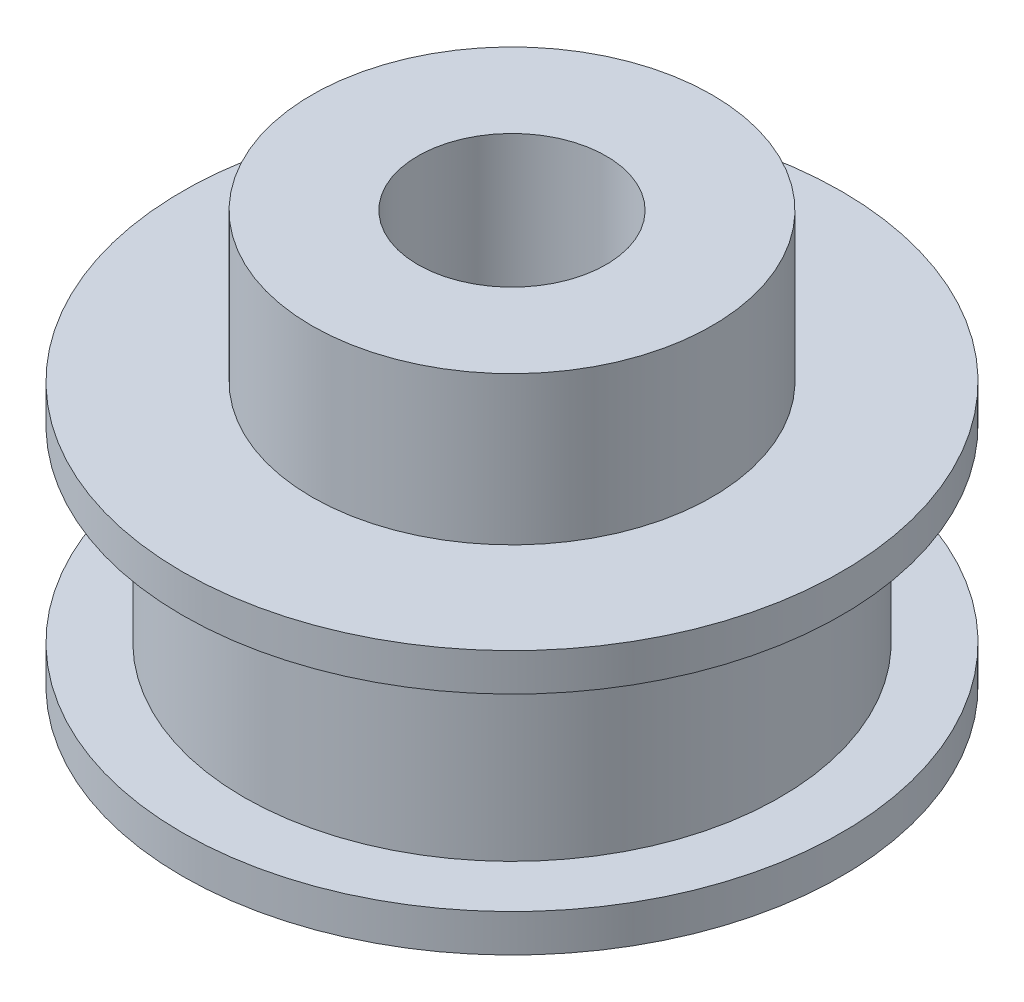
ISO-10303-21;
HEADER;
FILE_DESCRIPTION(('STEP AP214'),'2;1');
FILE_NAME('part.step','',(''),(''),'','','');
FILE_SCHEMA(('AUTOMOTIVE_DESIGN { 1 0 10303 214 1 1 1 1 }'));
ENDSEC;
DATA;
#1=APPLICATION_CONTEXT('core data for automotive mechanical design processes');
#2=APPLICATION_PROTOCOL_DEFINITION('international standard','automotive_design',2000,#1);
#3=PRODUCT_CONTEXT('',#1,'mechanical');
#4=PRODUCT('Part','Part','',(#3));
#5=PRODUCT_RELATED_PRODUCT_CATEGORY('part','',(#4));
#6=PRODUCT_DEFINITION_FORMATION('','',#4);
#7=PRODUCT_DEFINITION_CONTEXT('part definition',#1,'design');
#8=PRODUCT_DEFINITION('design','',#6,#7);
#9=PRODUCT_DEFINITION_SHAPE('','',#8);
#10=(LENGTH_UNIT() NAMED_UNIT(*) SI_UNIT(.MILLI.,.METRE.));
#11=(NAMED_UNIT(*) PLANE_ANGLE_UNIT() SI_UNIT($,.RADIAN.));
#12=(NAMED_UNIT(*) SI_UNIT($,.STERADIAN.) SOLID_ANGLE_UNIT());
#13=UNCERTAINTY_MEASURE_WITH_UNIT(LENGTH_MEASURE(1.E-05),#10,'distance_accuracy_value','');
#14=(GEOMETRIC_REPRESENTATION_CONTEXT(3) GLOBAL_UNCERTAINTY_ASSIGNED_CONTEXT((#13)) GLOBAL_UNIT_ASSIGNED_CONTEXT((#10,
#11,#12)) REPRESENTATION_CONTEXT('',''));
#15=CARTESIAN_POINT('',(0.,0.,0.));
#16=DIRECTION('',(0.,0.,1.));
#17=DIRECTION('',(1.,0.,0.));
#18=AXIS2_PLACEMENT_3D('',#15,#16,#17);
#19=CARTESIAN_POINT('',(0.,8.,0.));
#20=DIRECTION('',(0.,-1.,0.));
#21=DIRECTION('',(0.,0.,-1.));
#22=AXIS2_PLACEMENT_3D('',#19,#20,#21);
#23=CYLINDRICAL_SURFACE('',#22,11.39);
#24=CARTESIAN_POINT('',(0.,8.,0.));
#25=DIRECTION('',(0.,1.,0.));
#26=DIRECTION('',(0.,0.,1.));
#27=AXIS2_PLACEMENT_3D('',#24,#25,#26);
#28=CIRCLE('',#27,11.39);
#29=CARTESIAN_POINT('',(0.,8.,11.39));
#30=VERTEX_POINT('',#29);
#31=EDGE_CURVE('E37',#30,#30,#28,.T.);
#32=ORIENTED_EDGE('',*,*,#31,.F.);
#33=EDGE_LOOP('',(#32));
#34=FACE_BOUND('',#33,.T.);
#35=CARTESIAN_POINT('',(0.,0.,0.));
#36=DIRECTION('',(0.,1.,0.));
#37=DIRECTION('',(0.,0.,1.));
#38=AXIS2_PLACEMENT_3D('',#35,#36,#37);
#39=CIRCLE('',#38,11.39);
#40=CARTESIAN_POINT('',(0.,0.,11.39));
#41=VERTEX_POINT('',#40);
#42=EDGE_CURVE('E52',#41,#41,#39,.T.);
#43=ORIENTED_EDGE('',*,*,#42,.T.);
#44=EDGE_LOOP('',(#43));
#45=FACE_BOUND('',#44,.T.);
#46=ADVANCED_FACE('F30',(#34,#45),#23,.T.);
#47=CARTESIAN_POINT('',(0.,9.6,0.));
#48=DIRECTION('',(0.,-1.,0.));
#49=DIRECTION('',(0.,0.,-1.));
#50=AXIS2_PLACEMENT_3D('',#47,#48,#49);
#51=CYLINDRICAL_SURFACE('',#50,14.);
#52=CARTESIAN_POINT('',(0.,9.6,0.));
#53=DIRECTION('',(0.,1.,0.));
#54=DIRECTION('',(0.,0.,1.));
#55=AXIS2_PLACEMENT_3D('',#52,#53,#54);
#56=CIRCLE('',#55,14.);
#57=CARTESIAN_POINT('',(0.,9.6,14.));
#58=VERTEX_POINT('',#57);
#59=EDGE_CURVE('E42',#58,#58,#56,.T.);
#60=ORIENTED_EDGE('',*,*,#59,.F.);
#61=EDGE_LOOP('',(#60));
#62=FACE_BOUND('',#61,.T.);
#63=CARTESIAN_POINT('',(0.,8.,0.));
#64=DIRECTION('',(0.,1.,0.));
#65=DIRECTION('',(0.,0.,1.));
#66=AXIS2_PLACEMENT_3D('',#63,#64,#65);
#67=CIRCLE('',#66,14.);
#68=CARTESIAN_POINT('',(0.,8.,14.));
#69=VERTEX_POINT('',#68);
#70=EDGE_CURVE('E50',#69,#69,#67,.T.);
#71=ORIENTED_EDGE('',*,*,#70,.T.);
#72=EDGE_LOOP('',(#71));
#73=FACE_BOUND('',#72,.T.);
#74=ADVANCED_FACE('F86',(#62,#73),#51,.T.);
#75=CARTESIAN_POINT('',(0.,9.6,0.));
#76=DIRECTION('',(0.,1.,0.));
#77=DIRECTION('',(0.,0.,1.));
#78=AXIS2_PLACEMENT_3D('',#75,#76,#77);
#79=PLANE('',#78);
#80=CARTESIAN_POINT('',(0.,9.6,0.));
#81=DIRECTION('',(0.,1.,0.));
#82=DIRECTION('',(0.,0.,1.));
#83=AXIS2_PLACEMENT_3D('',#80,#81,#82);
#84=CIRCLE('',#83,8.5);
#85=CARTESIAN_POINT('',(0.,9.6,8.5));
#86=VERTEX_POINT('',#85);
#87=EDGE_CURVE('E10',#86,#86,#84,.T.);
#88=ORIENTED_EDGE('',*,*,#87,.F.);
#89=EDGE_LOOP('',(#88));
#90=FACE_BOUND('',#89,.T.);
#91=ORIENTED_EDGE('',*,*,#59,.T.);
#92=EDGE_LOOP('',(#91));
#93=FACE_BOUND('',#92,.T.);
#94=ADVANCED_FACE('F91',(#90,#93),#79,.T.);
#95=CARTESIAN_POINT('',(0.,8.,0.));
#96=DIRECTION('',(0.,1.,0.));
#97=DIRECTION('',(0.,0.,1.));
#98=AXIS2_PLACEMENT_3D('',#95,#96,#97);
#99=PLANE('',#98);
#100=ORIENTED_EDGE('',*,*,#31,.T.);
#101=EDGE_LOOP('',(#100));
#102=FACE_BOUND('',#101,.T.);
#103=ORIENTED_EDGE('',*,*,#70,.F.);
#104=EDGE_LOOP('',(#103));
#105=FACE_BOUND('',#104,.T.);
#106=ADVANCED_FACE('F95',(#102,#105),#99,.F.);
#107=CARTESIAN_POINT('',(0.,15.9,0.));
#108=DIRECTION('',(0.,-1.,0.));
#109=DIRECTION('',(0.,0.,-1.));
#110=AXIS2_PLACEMENT_3D('',#107,#108,#109);
#111=CYLINDRICAL_SURFACE('',#110,8.5);
#112=CARTESIAN_POINT('',(0.,15.9,0.));
#113=DIRECTION('',(0.,1.,0.));
#114=DIRECTION('',(0.,0.,1.));
#115=AXIS2_PLACEMENT_3D('',#112,#113,#114);
#116=CIRCLE('',#115,8.5);
#117=CARTESIAN_POINT('',(0.,15.9,8.5));
#118=VERTEX_POINT('',#117);
#119=EDGE_CURVE('E46',#118,#118,#116,.T.);
#120=ORIENTED_EDGE('',*,*,#119,.F.);
#121=EDGE_LOOP('',(#120));
#122=FACE_BOUND('',#121,.T.);
#123=ORIENTED_EDGE('',*,*,#87,.T.);
#124=EDGE_LOOP('',(#123));
#125=FACE_BOUND('',#124,.T.);
#126=ADVANCED_FACE('F98',(#122,#125),#111,.T.);
#127=CARTESIAN_POINT('',(0.,15.9,0.));
#128=DIRECTION('',(0.,1.,0.));
#129=DIRECTION('',(0.,0.,1.));
#130=AXIS2_PLACEMENT_3D('',#127,#128,#129);
#131=PLANE('',#130);
#132=CARTESIAN_POINT('',(0.,15.9,0.));
#133=DIRECTION('',(0.,1.,0.));
#134=DIRECTION('',(0.,0.,1.));
#135=AXIS2_PLACEMENT_3D('',#132,#133,#134);
#136=CIRCLE('',#135,4.);
#137=CARTESIAN_POINT('',(0.,15.9,4.));
#138=VERTEX_POINT('',#137);
#139=EDGE_CURVE('E33',#138,#138,#136,.T.);
#140=ORIENTED_EDGE('',*,*,#139,.F.);
#141=EDGE_LOOP('',(#140));
#142=FACE_BOUND('',#141,.T.);
#143=ORIENTED_EDGE('',*,*,#119,.T.);
#144=EDGE_LOOP('',(#143));
#145=FACE_BOUND('',#144,.T.);
#146=ADVANCED_FACE('F82',(#142,#145),#131,.T.);
#147=CARTESIAN_POINT('',(0.,0.,0.));
#148=DIRECTION('',(0.,1.,0.));
#149=DIRECTION('',(0.,0.,1.));
#150=AXIS2_PLACEMENT_3D('',#147,#148,#149);
#151=CYLINDRICAL_SURFACE('',#150,4.);
#152=ORIENTED_EDGE('',*,*,#139,.T.);
#153=EDGE_LOOP('',(#152));
#154=FACE_BOUND('',#153,.T.);
#155=CARTESIAN_POINT('',(0.,-1.6,0.));
#156=DIRECTION('',(0.,-1.,0.));
#157=DIRECTION('',(0.,0.,-1.));
#158=AXIS2_PLACEMENT_3D('',#155,#156,#157);
#159=CIRCLE('',#158,4.);
#160=CARTESIAN_POINT('',(0.,-1.6,-4.));
#161=VERTEX_POINT('',#160);
#162=EDGE_CURVE('E64',#161,#161,#159,.T.);
#163=ORIENTED_EDGE('',*,*,#162,.T.);
#164=EDGE_LOOP('',(#163));
#165=FACE_BOUND('',#164,.T.);
#166=ADVANCED_FACE('F69',(#154,#165),#151,.F.);
#167=CARTESIAN_POINT('',(0.,-1.6,0.));
#168=DIRECTION('',(0.,-1.,0.));
#169=DIRECTION('',(0.,0.,-1.));
#170=AXIS2_PLACEMENT_3D('',#167,#168,#169);
#171=PLANE('',#170);
#172=CARTESIAN_POINT('',(0.,-1.6,0.));
#173=DIRECTION('',(0.,-1.,0.));
#174=DIRECTION('',(0.,0.,-1.));
#175=AXIS2_PLACEMENT_3D('',#172,#173,#174);
#176=CIRCLE('',#175,14.);
#177=CARTESIAN_POINT('',(0.,-1.6,-14.));
#178=VERTEX_POINT('',#177);
#179=EDGE_CURVE('E54',#178,#178,#176,.T.);
#180=ORIENTED_EDGE('',*,*,#179,.T.);
#181=EDGE_LOOP('',(#180));
#182=FACE_BOUND('',#181,.T.);
#183=ORIENTED_EDGE('',*,*,#162,.F.);
#184=EDGE_LOOP('',(#183));
#185=FACE_BOUND('',#184,.T.);
#186=ADVANCED_FACE('F71',(#182,#185),#171,.T.);
#187=CARTESIAN_POINT('',(0.,0.,0.));
#188=DIRECTION('',(0.,-1.,0.));
#189=DIRECTION('',(0.,0.,-1.));
#190=AXIS2_PLACEMENT_3D('',#187,#188,#189);
#191=PLANE('',#190);
#192=ORIENTED_EDGE('',*,*,#42,.F.);
#193=EDGE_LOOP('',(#192));
#194=FACE_BOUND('',#193,.T.);
#195=CARTESIAN_POINT('',(0.,0.,0.));
#196=DIRECTION('',(0.,-1.,0.));
#197=DIRECTION('',(0.,0.,-1.));
#198=AXIS2_PLACEMENT_3D('',#195,#196,#197);
#199=CIRCLE('',#198,14.);
#200=CARTESIAN_POINT('',(0.,0.,-14.));
#201=VERTEX_POINT('',#200);
#202=EDGE_CURVE('E59',#201,#201,#199,.T.);
#203=ORIENTED_EDGE('',*,*,#202,.F.);
#204=EDGE_LOOP('',(#203));
#205=FACE_BOUND('',#204,.T.);
#206=ADVANCED_FACE('F73',(#194,#205),#191,.F.);
#207=CARTESIAN_POINT('',(0.,-1.6,0.));
#208=DIRECTION('',(0.,1.,0.));
#209=DIRECTION('',(0.,0.,1.));
#210=AXIS2_PLACEMENT_3D('',#207,#208,#209);
#211=CYLINDRICAL_SURFACE('',#210,14.);
#212=ORIENTED_EDGE('',*,*,#179,.F.);
#213=EDGE_LOOP('',(#212));
#214=FACE_BOUND('',#213,.T.);
#215=ORIENTED_EDGE('',*,*,#202,.T.);
#216=EDGE_LOOP('',(#215));
#217=FACE_BOUND('',#216,.T.);
#218=ADVANCED_FACE('F79',(#214,#217),#211,.T.);
#219=CLOSED_SHELL('',(#46,#74,#94,#106,#126,#146,#166,#186,#206,#218));
#220=MANIFOLD_SOLID_BREP('B2',#219);
#221=ADVANCED_BREP_SHAPE_REPRESENTATION('',(#18,#220),#14);
#222=SHAPE_DEFINITION_REPRESENTATION(#9,#221);
ENDSEC;
END-ISO-10303-21;
